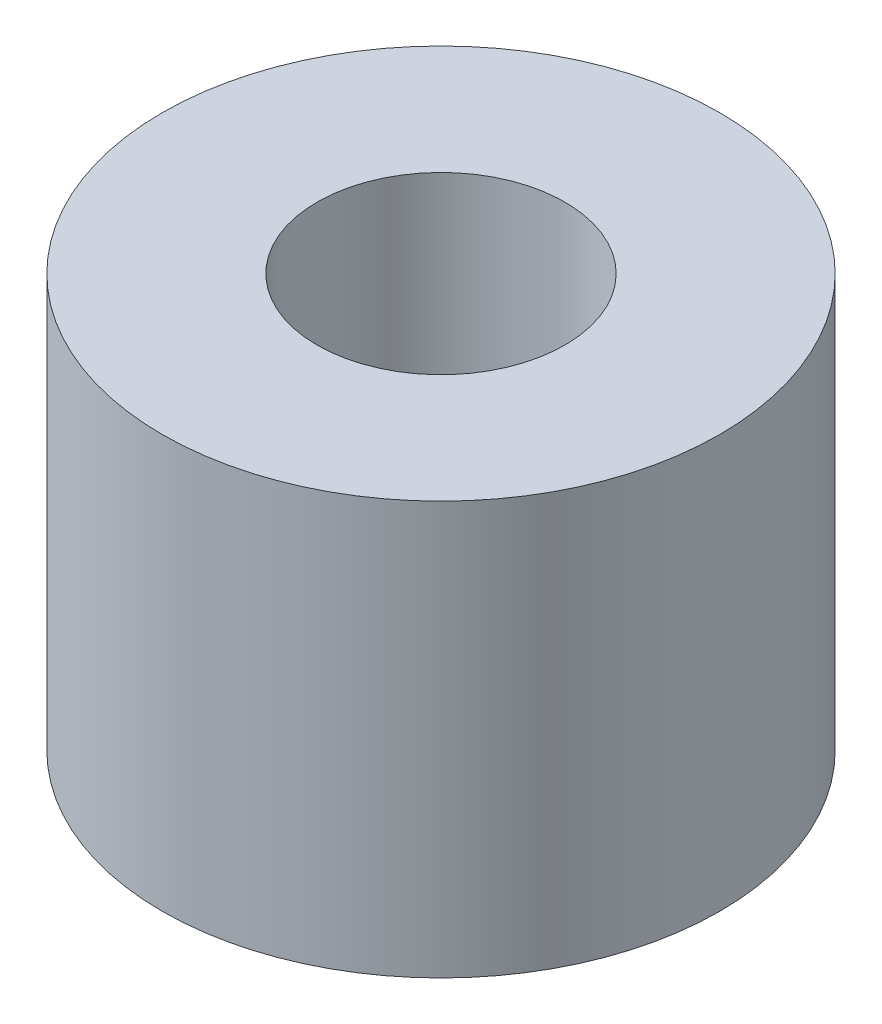
ISO-10303-21;
HEADER;
FILE_DESCRIPTION(('STEP AP214'),'2;1');
FILE_NAME('part.step','',(''),(''),'','','');
FILE_SCHEMA(('AUTOMOTIVE_DESIGN { 1 0 10303 214 1 1 1 1 }'));
ENDSEC;
DATA;
#1=APPLICATION_CONTEXT('core data for automotive mechanical design processes');
#2=APPLICATION_PROTOCOL_DEFINITION('international standard','automotive_design',2000,#1);
#3=PRODUCT_CONTEXT('',#1,'mechanical');
#4=PRODUCT('Part','Part','',(#3));
#5=PRODUCT_RELATED_PRODUCT_CATEGORY('part','',(#4));
#6=PRODUCT_DEFINITION_FORMATION('','',#4);
#7=PRODUCT_DEFINITION_CONTEXT('part definition',#1,'design');
#8=PRODUCT_DEFINITION('design','',#6,#7);
#9=PRODUCT_DEFINITION_SHAPE('','',#8);
#10=(LENGTH_UNIT() NAMED_UNIT(*) SI_UNIT(.MILLI.,.METRE.));
#11=(NAMED_UNIT(*) PLANE_ANGLE_UNIT() SI_UNIT($,.RADIAN.));
#12=(NAMED_UNIT(*) SI_UNIT($,.STERADIAN.) SOLID_ANGLE_UNIT());
#13=UNCERTAINTY_MEASURE_WITH_UNIT(LENGTH_MEASURE(1.E-05),#10,'distance_accuracy_value','');
#14=(GEOMETRIC_REPRESENTATION_CONTEXT(3) GLOBAL_UNCERTAINTY_ASSIGNED_CONTEXT((#13)) GLOBAL_UNIT_ASSIGNED_CONTEXT((#10,
#11,#12)) REPRESENTATION_CONTEXT('',''));
#15=CARTESIAN_POINT('',(0.,0.,0.));
#16=DIRECTION('',(0.,0.,1.));
#17=DIRECTION('',(1.,0.,0.));
#18=AXIS2_PLACEMENT_3D('',#15,#16,#17);
#19=CARTESIAN_POINT('',(0.,10.0184382603407,0.));
#20=DIRECTION('',(0.,1.,0.));
#21=DIRECTION('',(0.,0.,1.));
#22=AXIS2_PLACEMENT_3D('',#19,#20,#21);
#23=CYLINDRICAL_SURFACE('',#22,2.38125);
#24=CARTESIAN_POINT('',(0.,-3.96875,0.));
#25=DIRECTION('',(0.,1.,0.));
#26=DIRECTION('',(0.,0.,1.));
#27=AXIS2_PLACEMENT_3D('',#24,#25,#26);
#28=CIRCLE('',#27,2.38125);
#29=CARTESIAN_POINT('',(0.,-3.96875,2.38125));
#30=VERTEX_POINT('',#29);
#31=EDGE_CURVE('E46',#30,#30,#28,.T.);
#32=ORIENTED_EDGE('',*,*,#31,.F.);
#33=EDGE_LOOP('',(#32));
#34=FACE_BOUND('',#33,.T.);
#35=CARTESIAN_POINT('',(0.,3.96875,0.));
#36=DIRECTION('',(0.,1.,0.));
#37=DIRECTION('',(0.,0.,1.));
#38=AXIS2_PLACEMENT_3D('',#35,#36,#37);
#39=CIRCLE('',#38,2.38125);
#40=CARTESIAN_POINT('',(0.,3.96875,2.38125));
#41=VERTEX_POINT('',#40);
#42=EDGE_CURVE('E10',#41,#41,#39,.T.);
#43=ORIENTED_EDGE('',*,*,#42,.T.);
#44=EDGE_LOOP('',(#43));
#45=FACE_BOUND('',#44,.T.);
#46=ADVANCED_FACE('F32',(#34,#45),#23,.F.);
#47=CARTESIAN_POINT('',(0.,3.96875,-2.38125));
#48=DIRECTION('',(0.,-1.,0.));
#49=DIRECTION('',(0.,0.,-1.));
#50=AXIS2_PLACEMENT_3D('',#47,#48,#49);
#51=PLANE('',#50);
#52=ORIENTED_EDGE('',*,*,#42,.F.);
#53=EDGE_LOOP('',(#52));
#54=FACE_BOUND('',#53,.T.);
#55=CARTESIAN_POINT('',(0.,3.96875,0.));
#56=DIRECTION('',(0.,1.,0.));
#57=DIRECTION('',(0.,0.,1.));
#58=AXIS2_PLACEMENT_3D('',#55,#56,#57);
#59=CIRCLE('',#58,5.3578125);
#60=CARTESIAN_POINT('',(0.,3.96875,5.3578125));
#61=VERTEX_POINT('',#60);
#62=EDGE_CURVE('E38',#61,#61,#59,.T.);
#63=ORIENTED_EDGE('',*,*,#62,.T.);
#64=EDGE_LOOP('',(#63));
#65=FACE_BOUND('',#64,.T.);
#66=ADVANCED_FACE('F55',(#54,#65),#51,.F.);
#67=CARTESIAN_POINT('',(0.,10.0184382603407,0.));
#68=DIRECTION('',(0.,1.,0.));
#69=DIRECTION('',(0.,0.,1.));
#70=AXIS2_PLACEMENT_3D('',#67,#68,#69);
#71=CYLINDRICAL_SURFACE('',#70,5.3578125);
#72=ORIENTED_EDGE('',*,*,#62,.F.);
#73=EDGE_LOOP('',(#72));
#74=FACE_BOUND('',#73,.T.);
#75=CARTESIAN_POINT('',(0.,-3.96875,0.));
#76=DIRECTION('',(0.,1.,0.));
#77=DIRECTION('',(0.,0.,1.));
#78=AXIS2_PLACEMENT_3D('',#75,#76,#77);
#79=CIRCLE('',#78,5.3578125);
#80=CARTESIAN_POINT('',(0.,-3.96875,5.3578125));
#81=VERTEX_POINT('',#80);
#82=EDGE_CURVE('E42',#81,#81,#79,.T.);
#83=ORIENTED_EDGE('',*,*,#82,.T.);
#84=EDGE_LOOP('',(#83));
#85=FACE_BOUND('',#84,.T.);
#86=ADVANCED_FACE('F59',(#74,#85),#71,.T.);
#87=CARTESIAN_POINT('',(0.,-3.96875,-2.38125));
#88=DIRECTION('',(0.,1.,0.));
#89=DIRECTION('',(0.,0.,1.));
#90=AXIS2_PLACEMENT_3D('',#87,#88,#89);
#91=PLANE('',#90);
#92=ORIENTED_EDGE('',*,*,#82,.F.);
#93=EDGE_LOOP('',(#92));
#94=FACE_BOUND('',#93,.T.);
#95=ORIENTED_EDGE('',*,*,#31,.T.);
#96=EDGE_LOOP('',(#95));
#97=FACE_BOUND('',#96,.T.);
#98=ADVANCED_FACE('F52',(#94,#97),#91,.F.);
#99=CLOSED_SHELL('',(#46,#66,#86,#98));
#100=MANIFOLD_SOLID_BREP('B2',#99);
#101=ADVANCED_BREP_SHAPE_REPRESENTATION('',(#18,#100),#14);
#102=SHAPE_DEFINITION_REPRESENTATION(#9,#101);
ENDSEC;
END-ISO-10303-21;
